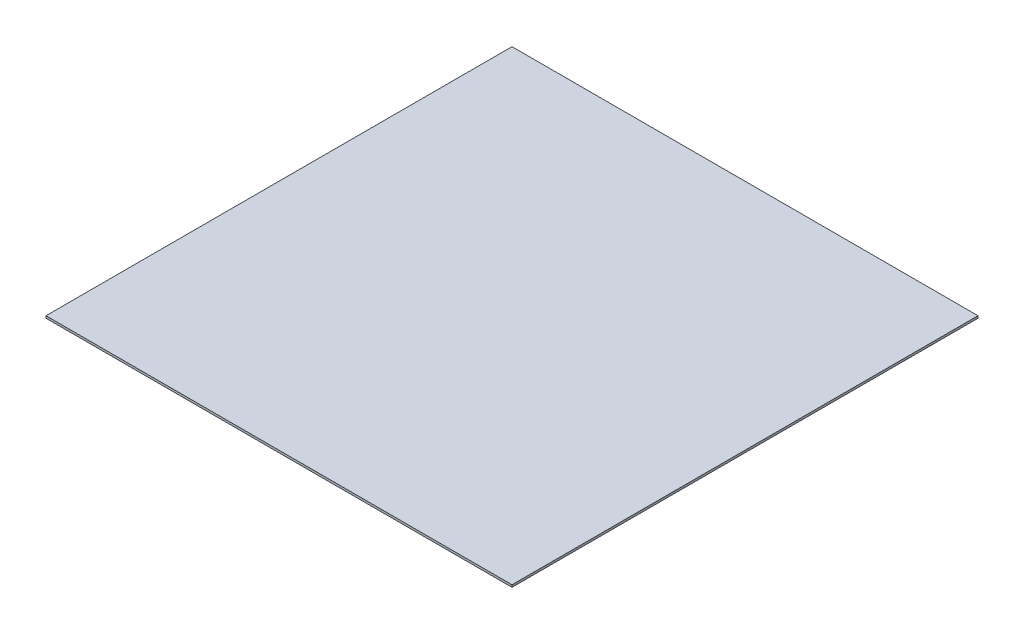
ISO-10303-21;
HEADER;
FILE_DESCRIPTION(('STEP AP214'),'2;1');
FILE_NAME('part.step','',(''),(''),'','','');
FILE_SCHEMA(('AUTOMOTIVE_DESIGN { 1 0 10303 214 1 1 1 1 }'));
ENDSEC;
DATA;
#1=APPLICATION_CONTEXT('core data for automotive mechanical design processes');
#2=APPLICATION_PROTOCOL_DEFINITION('international standard','automotive_design',2000,#1);
#3=PRODUCT_CONTEXT('',#1,'mechanical');
#4=PRODUCT('Part','Part','',(#3));
#5=PRODUCT_RELATED_PRODUCT_CATEGORY('part','',(#4));
#6=PRODUCT_DEFINITION_FORMATION('','',#4);
#7=PRODUCT_DEFINITION_CONTEXT('part definition',#1,'design');
#8=PRODUCT_DEFINITION('design','',#6,#7);
#9=PRODUCT_DEFINITION_SHAPE('','',#8);
#10=(LENGTH_UNIT() NAMED_UNIT(*) SI_UNIT(.MILLI.,.METRE.));
#11=(NAMED_UNIT(*) PLANE_ANGLE_UNIT() SI_UNIT($,.RADIAN.));
#12=(NAMED_UNIT(*) SI_UNIT($,.STERADIAN.) SOLID_ANGLE_UNIT());
#13=UNCERTAINTY_MEASURE_WITH_UNIT(LENGTH_MEASURE(1.E-05),#10,'distance_accuracy_value','');
#14=(GEOMETRIC_REPRESENTATION_CONTEXT(3) GLOBAL_UNCERTAINTY_ASSIGNED_CONTEXT((#13)) GLOBAL_UNIT_ASSIGNED_CONTEXT((#10,
#11,#12)) REPRESENTATION_CONTEXT('',''));
#15=CARTESIAN_POINT('',(0.,0.,0.));
#16=DIRECTION('',(0.,0.,1.));
#17=DIRECTION('',(1.,0.,0.));
#18=AXIS2_PLACEMENT_3D('',#15,#16,#17);
#19=CARTESIAN_POINT('',(0.,9.525,0.));
#20=DIRECTION('',(1.,0.,0.));
#21=DIRECTION('',(0.,0.,-1.));
#22=AXIS2_PLACEMENT_3D('',#19,#20,#21);
#23=PLANE('',#22);
#24=DIRECTION('',(0.,0.,1.));
#25=VECTOR('',#24,1.);
#26=CARTESIAN_POINT('',(0.,0.,0.));
#27=LINE('',#26,#25);
#28=CARTESIAN_POINT('',(0.,0.,0.));
#29=VERTEX_POINT('',#28);
#30=CARTESIAN_POINT('',(0.,0.,2000.));
#31=VERTEX_POINT('',#30);
#32=EDGE_CURVE('E99',#29,#31,#27,.T.);
#33=ORIENTED_EDGE('',*,*,#32,.T.);
#34=DIRECTION('',(0.,-1.,0.));
#35=VECTOR('',#34,1.);
#36=CARTESIAN_POINT('',(0.,9.525,2000.));
#37=LINE('',#36,#35);
#38=CARTESIAN_POINT('',(0.,9.525,2000.));
#39=VERTEX_POINT('',#38);
#40=EDGE_CURVE('E11',#39,#31,#37,.T.);
#41=ORIENTED_EDGE('',*,*,#40,.F.);
#42=DIRECTION('',(0.,0.,1.));
#43=VECTOR('',#42,1.);
#44=CARTESIAN_POINT('',(0.,9.525,0.));
#45=LINE('',#44,#43);
#46=CARTESIAN_POINT('',(0.,9.525,0.));
#47=VERTEX_POINT('',#46);
#48=EDGE_CURVE('E87',#47,#39,#45,.T.);
#49=ORIENTED_EDGE('',*,*,#48,.F.);
#50=DIRECTION('',(0.,-1.,0.));
#51=VECTOR('',#50,1.);
#52=CARTESIAN_POINT('',(0.,9.525,0.));
#53=LINE('',#52,#51);
#54=EDGE_CURVE('E95',#47,#29,#53,.T.);
#55=ORIENTED_EDGE('',*,*,#54,.T.);
#56=EDGE_LOOP('',(#33,#41,#49,#55));
#57=FACE_BOUND('',#56,.T.);
#58=ADVANCED_FACE('F36',(#57),#23,.F.);
#59=CARTESIAN_POINT('',(0.,9.525,2000.));
#60=DIRECTION('',(0.,0.,-1.));
#61=DIRECTION('',(-1.,0.,0.));
#62=AXIS2_PLACEMENT_3D('',#59,#60,#61);
#63=PLANE('',#62);
#64=DIRECTION('',(1.,0.,0.));
#65=VECTOR('',#64,1.);
#66=CARTESIAN_POINT('',(0.,0.,2000.));
#67=LINE('',#66,#65);
#68=CARTESIAN_POINT('',(2000.,0.,2000.));
#69=VERTEX_POINT('',#68);
#70=EDGE_CURVE('E91',#31,#69,#67,.T.);
#71=ORIENTED_EDGE('',*,*,#70,.T.);
#72=DIRECTION('',(0.,-1.,0.));
#73=VECTOR('',#72,1.);
#74=CARTESIAN_POINT('',(2000.,9.525,2000.));
#75=LINE('',#74,#73);
#76=CARTESIAN_POINT('',(2000.,9.525,2000.));
#77=VERTEX_POINT('',#76);
#78=EDGE_CURVE('E44',#77,#69,#75,.T.);
#79=ORIENTED_EDGE('',*,*,#78,.F.);
#80=DIRECTION('',(1.,0.,0.));
#81=VECTOR('',#80,1.);
#82=CARTESIAN_POINT('',(0.,9.525,2000.));
#83=LINE('',#82,#81);
#84=EDGE_CURVE('E82',#39,#77,#83,.T.);
#85=ORIENTED_EDGE('',*,*,#84,.F.);
#86=ORIENTED_EDGE('',*,*,#40,.T.);
#87=EDGE_LOOP('',(#71,#79,#85,#86));
#88=FACE_BOUND('',#87,.T.);
#89=ADVANCED_FACE('F90',(#88),#63,.F.);
#90=CARTESIAN_POINT('',(2000.,9.525,0.));
#91=DIRECTION('',(-1.,0.,0.));
#92=DIRECTION('',(0.,0.,1.));
#93=AXIS2_PLACEMENT_3D('',#90,#91,#92);
#94=PLANE('',#93);
#95=DIRECTION('',(0.,0.,-1.));
#96=VECTOR('',#95,1.);
#97=CARTESIAN_POINT('',(2000.,0.,0.));
#98=LINE('',#97,#96);
#99=CARTESIAN_POINT('',(2000.,0.,0.));
#100=VERTEX_POINT('',#99);
#101=EDGE_CURVE('E69',#69,#100,#98,.T.);
#102=ORIENTED_EDGE('',*,*,#101,.T.);
#103=DIRECTION('',(0.,-1.,0.));
#104=VECTOR('',#103,1.);
#105=CARTESIAN_POINT('',(2000.,9.525,0.));
#106=LINE('',#105,#104);
#107=CARTESIAN_POINT('',(2000.,9.525,0.));
#108=VERTEX_POINT('',#107);
#109=EDGE_CURVE('E92',#108,#100,#106,.T.);
#110=ORIENTED_EDGE('',*,*,#109,.F.);
#111=DIRECTION('',(0.,0.,-1.));
#112=VECTOR('',#111,1.);
#113=CARTESIAN_POINT('',(2000.,9.525,0.));
#114=LINE('',#113,#112);
#115=EDGE_CURVE('E85',#77,#108,#114,.T.);
#116=ORIENTED_EDGE('',*,*,#115,.F.);
#117=ORIENTED_EDGE('',*,*,#78,.T.);
#118=EDGE_LOOP('',(#102,#110,#116,#117));
#119=FACE_BOUND('',#118,.T.);
#120=ADVANCED_FACE('F93',(#119),#94,.F.);
#121=CARTESIAN_POINT('',(0.,9.525,0.));
#122=DIRECTION('',(0.,0.,1.));
#123=DIRECTION('',(1.,0.,0.));
#124=AXIS2_PLACEMENT_3D('',#121,#122,#123);
#125=PLANE('',#124);
#126=DIRECTION('',(-1.,0.,0.));
#127=VECTOR('',#126,1.);
#128=CARTESIAN_POINT('',(0.,0.,0.));
#129=LINE('',#128,#127);
#130=EDGE_CURVE('E75',#100,#29,#129,.T.);
#131=ORIENTED_EDGE('',*,*,#130,.T.);
#132=ORIENTED_EDGE('',*,*,#54,.F.);
#133=DIRECTION('',(-1.,0.,0.));
#134=VECTOR('',#133,1.);
#135=CARTESIAN_POINT('',(0.,9.525,0.));
#136=LINE('',#135,#134);
#137=EDGE_CURVE('E52',#108,#47,#136,.T.);
#138=ORIENTED_EDGE('',*,*,#137,.F.);
#139=ORIENTED_EDGE('',*,*,#109,.T.);
#140=EDGE_LOOP('',(#131,#132,#138,#139));
#141=FACE_BOUND('',#140,.T.);
#142=ADVANCED_FACE('F106',(#141),#125,.F.);
#143=CARTESIAN_POINT('',(0.,9.525,0.));
#144=DIRECTION('',(0.,1.,0.));
#145=DIRECTION('',(0.,0.,1.));
#146=AXIS2_PLACEMENT_3D('',#143,#144,#145);
#147=PLANE('',#146);
#148=ORIENTED_EDGE('',*,*,#48,.T.);
#149=ORIENTED_EDGE('',*,*,#84,.T.);
#150=ORIENTED_EDGE('',*,*,#115,.T.);
#151=ORIENTED_EDGE('',*,*,#137,.T.);
#152=EDGE_LOOP('',(#148,#149,#150,#151));
#153=FACE_BOUND('',#152,.T.);
#154=ADVANCED_FACE('F83',(#153),#147,.T.);
#155=CARTESIAN_POINT('',(0.,0.,0.));
#156=DIRECTION('',(0.,1.,0.));
#157=DIRECTION('',(0.,0.,1.));
#158=AXIS2_PLACEMENT_3D('',#155,#156,#157);
#159=PLANE('',#158);
#160=ORIENTED_EDGE('',*,*,#32,.F.);
#161=ORIENTED_EDGE('',*,*,#130,.F.);
#162=ORIENTED_EDGE('',*,*,#101,.F.);
#163=ORIENTED_EDGE('',*,*,#70,.F.);
#164=EDGE_LOOP('',(#160,#161,#162,#163));
#165=FACE_BOUND('',#164,.T.);
#166=ADVANCED_FACE('F109',(#165),#159,.F.);
#167=CLOSED_SHELL('',(#58,#89,#120,#142,#154,#166));
#168=MANIFOLD_SOLID_BREP('B2',#167);
#169=ADVANCED_BREP_SHAPE_REPRESENTATION('',(#18,#168),#14);
#170=SHAPE_DEFINITION_REPRESENTATION(#9,#169);
ENDSEC;
END-ISO-10303-21;
